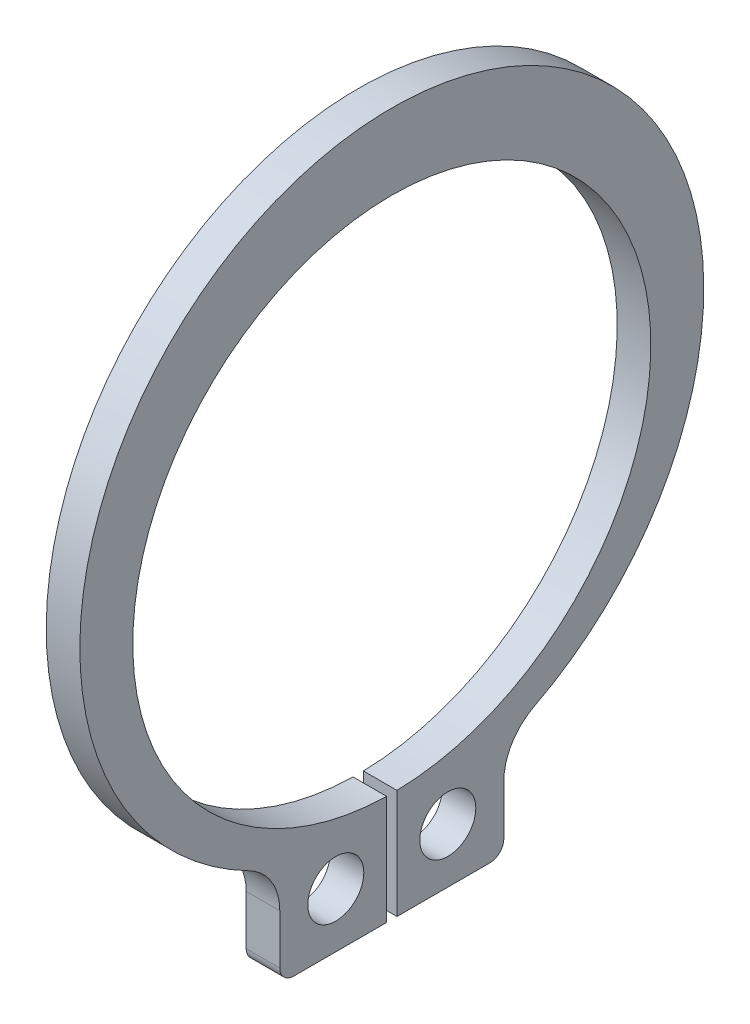
ISO-10303-21;
HEADER;
FILE_DESCRIPTION(('STEP AP214'),'2;1');
FILE_NAME('part.step','',(''),(''),'','','');
FILE_SCHEMA(('AUTOMOTIVE_DESIGN { 1 0 10303 214 1 1 1 1 }'));
ENDSEC;
DATA;
#1=APPLICATION_CONTEXT('core data for automotive mechanical design processes');
#2=APPLICATION_PROTOCOL_DEFINITION('international standard','automotive_design',2000,#1);
#3=PRODUCT_CONTEXT('',#1,'mechanical');
#4=PRODUCT('Part','Part','',(#3));
#5=PRODUCT_RELATED_PRODUCT_CATEGORY('part','',(#4));
#6=PRODUCT_DEFINITION_FORMATION('','',#4);
#7=PRODUCT_DEFINITION_CONTEXT('part definition',#1,'design');
#8=PRODUCT_DEFINITION('design','',#6,#7);
#9=PRODUCT_DEFINITION_SHAPE('','',#8);
#10=(LENGTH_UNIT() NAMED_UNIT(*) SI_UNIT(.MILLI.,.METRE.));
#11=(NAMED_UNIT(*) PLANE_ANGLE_UNIT() SI_UNIT($,.RADIAN.));
#12=(NAMED_UNIT(*) SI_UNIT($,.STERADIAN.) SOLID_ANGLE_UNIT());
#13=UNCERTAINTY_MEASURE_WITH_UNIT(LENGTH_MEASURE(1.E-05),#10,'distance_accuracy_value','');
#14=(GEOMETRIC_REPRESENTATION_CONTEXT(3) GLOBAL_UNCERTAINTY_ASSIGNED_CONTEXT((#13)) GLOBAL_UNIT_ASSIGNED_CONTEXT((#10,
#11,#12)) REPRESENTATION_CONTEXT('',''));
#15=CARTESIAN_POINT('',(0.,0.,0.));
#16=DIRECTION('',(0.,0.,1.));
#17=DIRECTION('',(1.,0.,0.));
#18=AXIS2_PLACEMENT_3D('',#15,#16,#17);
#19=CARTESIAN_POINT('',(0.6,-10.8801496996403,-6.));
#20=DIRECTION('',(-1.,0.,0.));
#21=DIRECTION('',(0.,0.,1.));
#22=AXIS2_PLACEMENT_3D('',#19,#20,#21);
#23=PLANE('',#22);
#24=CARTESIAN_POINT('',(0.6,-11.2,-2.));
#25=DIRECTION('',(1.,0.,0.));
#26=DIRECTION('',(0.,0.,-1.));
#27=AXIS2_PLACEMENT_3D('',#24,#25,#26);
#28=CIRCLE('',#27,1.);
#29=CARTESIAN_POINT('',(0.6,-11.2,-3.));
#30=VERTEX_POINT('',#29);
#31=EDGE_CURVE('E181',#30,#30,#28,.T.);
#32=ORIENTED_EDGE('',*,*,#31,.F.);
#33=EDGE_LOOP('',(#32));
#34=FACE_BOUND('',#33,.T.);
#35=CARTESIAN_POINT('',(0.6,-10.8801496996403,-6.));
#36=DIRECTION('',(-1.,0.,0.));
#37=DIRECTION('',(0.,0.,1.));
#38=AXIS2_PLACEMENT_3D('',#35,#36,#37);
#39=CIRCLE('',#38,2.);
#40=CARTESIAN_POINT('',(0.6,-10.8801496996403,-4.));
#41=VERTEX_POINT('',#40);
#42=CARTESIAN_POINT('',(0.6,-9.10082702568882,-5.08675807040949));
#43=VERTEX_POINT('',#42);
#44=EDGE_CURVE('E184',#41,#43,#39,.T.);
#45=ORIENTED_EDGE('',*,*,#44,.T.);
#46=CARTESIAN_POINT('',(0.6,0.809999999999997,0.));
#47=DIRECTION('',(1.,0.,0.));
#48=DIRECTION('',(0.,0.,-1.));
#49=AXIS2_PLACEMENT_3D('',#46,#47,#48);
#50=CIRCLE('',#49,11.14);
#51=CARTESIAN_POINT('',(0.6,-9.10082697223238,5.08675817456179));
#52=VERTEX_POINT('',#51);
#53=EDGE_CURVE('E128',#43,#52,#50,.T.);
#54=ORIENTED_EDGE('',*,*,#53,.T.);
#55=CARTESIAN_POINT('',(0.6,-10.8801496996403,6.00000000000004));
#56=DIRECTION('',(-1.,0.,0.));
#57=DIRECTION('',(0.,0.,1.));
#58=AXIS2_PLACEMENT_3D('',#55,#56,#57);
#59=CIRCLE('',#58,2.00000000000004);
#60=CARTESIAN_POINT('',(0.6,-10.8801496996403,4.));
#61=VERTEX_POINT('',#60);
#62=EDGE_CURVE('E187',#52,#61,#59,.T.);
#63=ORIENTED_EDGE('',*,*,#62,.T.);
#64=DIRECTION('',(0.,-1.,0.));
#65=VECTOR('',#64,1.);
#66=CARTESIAN_POINT('',(0.6,-10.8801496996403,4.));
#67=LINE('',#66,#65);
#68=CARTESIAN_POINT('',(0.6,-12.65,4.));
#69=VERTEX_POINT('',#68);
#70=EDGE_CURVE('E189',#61,#69,#67,.T.);
#71=ORIENTED_EDGE('',*,*,#70,.T.);
#72=CARTESIAN_POINT('',(0.6,-12.65,3.5));
#73=DIRECTION('',(1.,0.,0.));
#74=DIRECTION('',(0.,0.,-1.));
#75=AXIS2_PLACEMENT_3D('',#72,#73,#74);
#76=CIRCLE('',#75,0.499999999999999);
#77=CARTESIAN_POINT('',(0.6,-13.15,3.5));
#78=VERTEX_POINT('',#77);
#79=EDGE_CURVE('E191',#69,#78,#76,.T.);
#80=ORIENTED_EDGE('',*,*,#79,.T.);
#81=DIRECTION('',(0.,0.,-1.));
#82=VECTOR('',#81,1.);
#83=CARTESIAN_POINT('',(0.6,-13.15,3.5));
#84=LINE('',#83,#82);
#85=CARTESIAN_POINT('',(0.6,-13.15,0.185));
#86=VERTEX_POINT('',#85);
#87=EDGE_CURVE('E193',#78,#86,#84,.T.);
#88=ORIENTED_EDGE('',*,*,#87,.T.);
#89=DIRECTION('',(0.,1.,0.));
#90=VECTOR('',#89,1.);
#91=CARTESIAN_POINT('',(0.6,-13.15,0.185));
#92=LINE('',#91,#90);
#93=CARTESIAN_POINT('',(0.6,-9.24814981496299,0.185));
#94=VERTEX_POINT('',#93);
#95=EDGE_CURVE('E195',#86,#94,#92,.T.);
#96=ORIENTED_EDGE('',*,*,#95,.T.);
#97=CARTESIAN_POINT('',(0.6,0.,0.));
#98=DIRECTION('',(-1.,0.,0.));
#99=DIRECTION('',(0.,0.,1.));
#100=AXIS2_PLACEMENT_3D('',#97,#98,#99);
#101=CIRCLE('',#100,9.25);
#102=CARTESIAN_POINT('',(0.6,-9.24814981496299,-0.184999999999998));
#103=VERTEX_POINT('',#102);
#104=EDGE_CURVE('E197',#94,#103,#101,.T.);
#105=ORIENTED_EDGE('',*,*,#104,.T.);
#106=DIRECTION('',(0.,-1.,0.));
#107=VECTOR('',#106,1.);
#108=CARTESIAN_POINT('',(0.6,-9.24814981496299,-0.185));
#109=LINE('',#108,#107);
#110=CARTESIAN_POINT('',(0.6,-13.15,-0.185));
#111=VERTEX_POINT('',#110);
#112=EDGE_CURVE('E199',#103,#111,#109,.T.);
#113=ORIENTED_EDGE('',*,*,#112,.T.);
#114=DIRECTION('',(0.,0.,-1.));
#115=VECTOR('',#114,1.);
#116=CARTESIAN_POINT('',(0.6,-13.15,-0.185));
#117=LINE('',#116,#115);
#118=CARTESIAN_POINT('',(0.6,-13.15,-3.5));
#119=VERTEX_POINT('',#118);
#120=EDGE_CURVE('E201',#111,#119,#117,.T.);
#121=ORIENTED_EDGE('',*,*,#120,.T.);
#122=CARTESIAN_POINT('',(0.6,-12.65,-3.5));
#123=DIRECTION('',(1.,0.,0.));
#124=DIRECTION('',(0.,0.,-1.));
#125=AXIS2_PLACEMENT_3D('',#122,#123,#124);
#126=CIRCLE('',#125,0.500000000000002);
#127=CARTESIAN_POINT('',(0.6,-12.65,-4.));
#128=VERTEX_POINT('',#127);
#129=EDGE_CURVE('E56',#119,#128,#126,.T.);
#130=ORIENTED_EDGE('',*,*,#129,.T.);
#131=DIRECTION('',(0.,1.,0.));
#132=VECTOR('',#131,1.);
#133=CARTESIAN_POINT('',(0.6,-12.65,-4.));
#134=LINE('',#133,#132);
#135=EDGE_CURVE('E51',#128,#41,#134,.T.);
#136=ORIENTED_EDGE('',*,*,#135,.T.);
#137=EDGE_LOOP('',(#45,#54,#63,#71,#80,#88,#96,#105,#113,#121,#130,#136));
#138=FACE_BOUND('',#137,.T.);
#139=CARTESIAN_POINT('',(0.6,-11.2,2.));
#140=DIRECTION('',(1.,0.,0.));
#141=DIRECTION('',(0.,0.,-1.));
#142=AXIS2_PLACEMENT_3D('',#139,#140,#141);
#143=CIRCLE('',#142,1.);
#144=CARTESIAN_POINT('',(0.6,-11.2,1.));
#145=VERTEX_POINT('',#144);
#146=EDGE_CURVE('E178',#145,#145,#143,.T.);
#147=ORIENTED_EDGE('',*,*,#146,.F.);
#148=EDGE_LOOP('',(#147));
#149=FACE_BOUND('',#148,.T.);
#150=ADVANCED_FACE('F36',(#34,#138,#149),#23,.F.);
#151=CARTESIAN_POINT('',(0.6,-10.8801496996403,-6.));
#152=DIRECTION('',(-1.,0.,0.));
#153=DIRECTION('',(0.,0.,1.));
#154=AXIS2_PLACEMENT_3D('',#151,#152,#153);
#155=CYLINDRICAL_SURFACE('',#154,2.);
#156=DIRECTION('',(-1.,0.,0.));
#157=VECTOR('',#156,1.);
#158=CARTESIAN_POINT('',(0.6,-10.8801496996403,-4.));
#159=LINE('',#158,#157);
#160=CARTESIAN_POINT('',(-0.6,-10.8801496996403,-4.));
#161=VERTEX_POINT('',#160);
#162=EDGE_CURVE('E143',#41,#161,#159,.T.);
#163=ORIENTED_EDGE('',*,*,#162,.T.);
#164=CARTESIAN_POINT('',(-0.6,-10.8801496996403,-6.));
#165=DIRECTION('',(-1.,0.,0.));
#166=DIRECTION('',(0.,0.,1.));
#167=AXIS2_PLACEMENT_3D('',#164,#165,#166);
#168=CIRCLE('',#167,2.);
#169=CARTESIAN_POINT('',(-0.6,-9.10082702568882,-5.08675807040949));
#170=VERTEX_POINT('',#169);
#171=EDGE_CURVE('E137',#161,#170,#168,.T.);
#172=ORIENTED_EDGE('',*,*,#171,.T.);
#173=DIRECTION('',(-1.,0.,0.));
#174=VECTOR('',#173,1.);
#175=CARTESIAN_POINT('',(0.6,-9.10082702568882,-5.08675807040949));
#176=LINE('',#175,#174);
#177=EDGE_CURVE('E11',#43,#170,#176,.T.);
#178=ORIENTED_EDGE('',*,*,#177,.F.);
#179=ORIENTED_EDGE('',*,*,#44,.F.);
#180=EDGE_LOOP('',(#163,#172,#178,#179));
#181=FACE_BOUND('',#180,.T.);
#182=ADVANCED_FACE('F38',(#181),#155,.F.);
#183=CARTESIAN_POINT('',(0.6,0.809999999999997,0.));
#184=DIRECTION('',(-1.,0.,0.));
#185=DIRECTION('',(0.,0.,1.));
#186=AXIS2_PLACEMENT_3D('',#183,#184,#185);
#187=CYLINDRICAL_SURFACE('',#186,11.14);
#188=ORIENTED_EDGE('',*,*,#177,.T.);
#189=CARTESIAN_POINT('',(-0.6,0.809999999999997,0.));
#190=DIRECTION('',(1.,0.,0.));
#191=DIRECTION('',(0.,0.,-1.));
#192=AXIS2_PLACEMENT_3D('',#189,#190,#191);
#193=CIRCLE('',#192,11.14);
#194=CARTESIAN_POINT('',(-0.6,-9.10082697223238,5.08675817456179));
#195=VERTEX_POINT('',#194);
#196=EDGE_CURVE('E127',#170,#195,#193,.T.);
#197=ORIENTED_EDGE('',*,*,#196,.T.);
#198=DIRECTION('',(-1.,0.,0.));
#199=VECTOR('',#198,1.);
#200=CARTESIAN_POINT('',(0.6,-9.10082697223238,5.08675817456179));
#201=LINE('',#200,#199);
#202=EDGE_CURVE('E44',#52,#195,#201,.T.);
#203=ORIENTED_EDGE('',*,*,#202,.F.);
#204=ORIENTED_EDGE('',*,*,#53,.F.);
#205=EDGE_LOOP('',(#188,#197,#203,#204));
#206=FACE_BOUND('',#205,.T.);
#207=ADVANCED_FACE('F125',(#206),#187,.T.);
#208=CARTESIAN_POINT('',(0.6,-10.8801496996403,6.00000000000004));
#209=DIRECTION('',(-1.,0.,0.));
#210=DIRECTION('',(0.,0.,1.));
#211=AXIS2_PLACEMENT_3D('',#208,#209,#210);
#212=CYLINDRICAL_SURFACE('',#211,2.00000000000004);
#213=ORIENTED_EDGE('',*,*,#202,.T.);
#214=CARTESIAN_POINT('',(-0.6,-10.8801496996403,6.00000000000004));
#215=DIRECTION('',(-1.,0.,0.));
#216=DIRECTION('',(0.,0.,1.));
#217=AXIS2_PLACEMENT_3D('',#214,#215,#216);
#218=CIRCLE('',#217,2.00000000000004);
#219=CARTESIAN_POINT('',(-0.6,-10.8801496996403,4.));
#220=VERTEX_POINT('',#219);
#221=EDGE_CURVE('E141',#195,#220,#218,.T.);
#222=ORIENTED_EDGE('',*,*,#221,.T.);
#223=DIRECTION('',(-1.,0.,0.));
#224=VECTOR('',#223,1.);
#225=CARTESIAN_POINT('',(0.6,-10.8801496996403,4.));
#226=LINE('',#225,#224);
#227=EDGE_CURVE('E222',#61,#220,#226,.T.);
#228=ORIENTED_EDGE('',*,*,#227,.F.);
#229=ORIENTED_EDGE('',*,*,#62,.F.);
#230=EDGE_LOOP('',(#213,#222,#228,#229));
#231=FACE_BOUND('',#230,.T.);
#232=ADVANCED_FACE('F225',(#231),#212,.F.);
#233=CARTESIAN_POINT('',(0.6,-10.8801496996403,4.));
#234=DIRECTION('',(0.,0.,-1.));
#235=DIRECTION('',(-1.,0.,0.));
#236=AXIS2_PLACEMENT_3D('',#233,#234,#235);
#237=PLANE('',#236);
#238=ORIENTED_EDGE('',*,*,#227,.T.);
#239=DIRECTION('',(0.,-1.,0.));
#240=VECTOR('',#239,1.);
#241=CARTESIAN_POINT('',(-0.6,-10.8801496996403,4.));
#242=LINE('',#241,#240);
#243=CARTESIAN_POINT('',(-0.6,-12.65,4.));
#244=VERTEX_POINT('',#243);
#245=EDGE_CURVE('E152',#220,#244,#242,.T.);
#246=ORIENTED_EDGE('',*,*,#245,.T.);
#247=DIRECTION('',(-1.,0.,0.));
#248=VECTOR('',#247,1.);
#249=CARTESIAN_POINT('',(0.6,-12.65,4.));
#250=LINE('',#249,#248);
#251=EDGE_CURVE('E220',#69,#244,#250,.T.);
#252=ORIENTED_EDGE('',*,*,#251,.F.);
#253=ORIENTED_EDGE('',*,*,#70,.F.);
#254=EDGE_LOOP('',(#238,#246,#252,#253));
#255=FACE_BOUND('',#254,.T.);
#256=ADVANCED_FACE('F233',(#255),#237,.F.);
#257=CARTESIAN_POINT('',(0.6,-12.65,3.5));
#258=DIRECTION('',(-1.,0.,0.));
#259=DIRECTION('',(0.,0.,1.));
#260=AXIS2_PLACEMENT_3D('',#257,#258,#259);
#261=CYLINDRICAL_SURFACE('',#260,0.499999999999999);
#262=ORIENTED_EDGE('',*,*,#251,.T.);
#263=CARTESIAN_POINT('',(-0.6,-12.65,3.5));
#264=DIRECTION('',(1.,0.,0.));
#265=DIRECTION('',(0.,0.,-1.));
#266=AXIS2_PLACEMENT_3D('',#263,#264,#265);
#267=CIRCLE('',#266,0.499999999999999);
#268=CARTESIAN_POINT('',(-0.6,-13.15,3.5));
#269=VERTEX_POINT('',#268);
#270=EDGE_CURVE('E155',#244,#269,#267,.T.);
#271=ORIENTED_EDGE('',*,*,#270,.T.);
#272=DIRECTION('',(-1.,0.,0.));
#273=VECTOR('',#272,1.);
#274=CARTESIAN_POINT('',(0.6,-13.15,3.5));
#275=LINE('',#274,#273);
#276=EDGE_CURVE('E218',#78,#269,#275,.T.);
#277=ORIENTED_EDGE('',*,*,#276,.F.);
#278=ORIENTED_EDGE('',*,*,#79,.F.);
#279=EDGE_LOOP('',(#262,#271,#277,#278));
#280=FACE_BOUND('',#279,.T.);
#281=ADVANCED_FACE('F236',(#280),#261,.T.);
#282=CARTESIAN_POINT('',(0.6,-13.15,3.5));
#283=DIRECTION('',(0.,1.,0.));
#284=DIRECTION('',(0.,0.,1.));
#285=AXIS2_PLACEMENT_3D('',#282,#283,#284);
#286=PLANE('',#285);
#287=ORIENTED_EDGE('',*,*,#276,.T.);
#288=DIRECTION('',(0.,0.,-1.));
#289=VECTOR('',#288,1.);
#290=CARTESIAN_POINT('',(-0.6,-13.15,3.5));
#291=LINE('',#290,#289);
#292=CARTESIAN_POINT('',(-0.6,-13.15,0.185));
#293=VERTEX_POINT('',#292);
#294=EDGE_CURVE('E158',#269,#293,#291,.T.);
#295=ORIENTED_EDGE('',*,*,#294,.T.);
#296=DIRECTION('',(-1.,0.,0.));
#297=VECTOR('',#296,1.);
#298=CARTESIAN_POINT('',(0.6,-13.15,0.185));
#299=LINE('',#298,#297);
#300=EDGE_CURVE('E216',#86,#293,#299,.T.);
#301=ORIENTED_EDGE('',*,*,#300,.F.);
#302=ORIENTED_EDGE('',*,*,#87,.F.);
#303=EDGE_LOOP('',(#287,#295,#301,#302));
#304=FACE_BOUND('',#303,.T.);
#305=ADVANCED_FACE('F241',(#304),#286,.F.);
#306=CARTESIAN_POINT('',(0.6,-13.15,0.185));
#307=DIRECTION('',(0.,0.,1.));
#308=DIRECTION('',(0.,-1.,0.));
#309=AXIS2_PLACEMENT_3D('',#306,#307,#308);
#310=PLANE('',#309);
#311=ORIENTED_EDGE('',*,*,#300,.T.);
#312=DIRECTION('',(0.,1.,0.));
#313=VECTOR('',#312,1.);
#314=CARTESIAN_POINT('',(-0.6,-13.15,0.185));
#315=LINE('',#314,#313);
#316=CARTESIAN_POINT('',(-0.6,-9.24814981496299,0.185));
#317=VERTEX_POINT('',#316);
#318=EDGE_CURVE('E161',#293,#317,#315,.T.);
#319=ORIENTED_EDGE('',*,*,#318,.T.);
#320=DIRECTION('',(-1.,0.,0.));
#321=VECTOR('',#320,1.);
#322=CARTESIAN_POINT('',(0.6,-9.24814981496299,0.185));
#323=LINE('',#322,#321);
#324=EDGE_CURVE('E214',#94,#317,#323,.T.);
#325=ORIENTED_EDGE('',*,*,#324,.F.);
#326=ORIENTED_EDGE('',*,*,#95,.F.);
#327=EDGE_LOOP('',(#311,#319,#325,#326));
#328=FACE_BOUND('',#327,.T.);
#329=ADVANCED_FACE('F247',(#328),#310,.F.);
#330=CARTESIAN_POINT('',(0.6,0.,0.));
#331=DIRECTION('',(-1.,0.,0.));
#332=DIRECTION('',(0.,0.,1.));
#333=AXIS2_PLACEMENT_3D('',#330,#331,#332);
#334=CYLINDRICAL_SURFACE('',#333,9.25);
#335=ORIENTED_EDGE('',*,*,#324,.T.);
#336=CARTESIAN_POINT('',(-0.6,0.,0.));
#337=DIRECTION('',(-1.,0.,0.));
#338=DIRECTION('',(0.,0.,1.));
#339=AXIS2_PLACEMENT_3D('',#336,#337,#338);
#340=CIRCLE('',#339,9.25);
#341=CARTESIAN_POINT('',(-0.6,-9.24814981496299,-0.184999999999998));
#342=VERTEX_POINT('',#341);
#343=EDGE_CURVE('E164',#317,#342,#340,.T.);
#344=ORIENTED_EDGE('',*,*,#343,.T.);
#345=DIRECTION('',(-1.,0.,0.));
#346=VECTOR('',#345,1.);
#347=CARTESIAN_POINT('',(0.6,-9.24814981496299,-0.184999999999998));
#348=LINE('',#347,#346);
#349=EDGE_CURVE('E212',#103,#342,#348,.T.);
#350=ORIENTED_EDGE('',*,*,#349,.F.);
#351=ORIENTED_EDGE('',*,*,#104,.F.);
#352=EDGE_LOOP('',(#335,#344,#350,#351));
#353=FACE_BOUND('',#352,.T.);
#354=ADVANCED_FACE('F251',(#353),#334,.F.);
#355=CARTESIAN_POINT('',(0.6,-9.24814981496299,-0.185));
#356=DIRECTION('',(0.,0.,-1.));
#357=DIRECTION('',(0.,1.,0.));
#358=AXIS2_PLACEMENT_3D('',#355,#356,#357);
#359=PLANE('',#358);
#360=ORIENTED_EDGE('',*,*,#349,.T.);
#361=DIRECTION('',(0.,-1.,0.));
#362=VECTOR('',#361,1.);
#363=CARTESIAN_POINT('',(-0.6,-9.24814981496299,-0.185));
#364=LINE('',#363,#362);
#365=CARTESIAN_POINT('',(-0.6,-13.15,-0.185));
#366=VERTEX_POINT('',#365);
#367=EDGE_CURVE('E167',#342,#366,#364,.T.);
#368=ORIENTED_EDGE('',*,*,#367,.T.);
#369=DIRECTION('',(-1.,0.,0.));
#370=VECTOR('',#369,1.);
#371=CARTESIAN_POINT('',(0.6,-13.15,-0.185));
#372=LINE('',#371,#370);
#373=EDGE_CURVE('E210',#111,#366,#372,.T.);
#374=ORIENTED_EDGE('',*,*,#373,.F.);
#375=ORIENTED_EDGE('',*,*,#112,.F.);
#376=EDGE_LOOP('',(#360,#368,#374,#375));
#377=FACE_BOUND('',#376,.T.);
#378=ADVANCED_FACE('F256',(#377),#359,.F.);
#379=CARTESIAN_POINT('',(0.6,-13.15,-0.185));
#380=DIRECTION('',(0.,1.,0.));
#381=DIRECTION('',(0.,0.,1.));
#382=AXIS2_PLACEMENT_3D('',#379,#380,#381);
#383=PLANE('',#382);
#384=ORIENTED_EDGE('',*,*,#373,.T.);
#385=DIRECTION('',(0.,0.,-1.));
#386=VECTOR('',#385,1.);
#387=CARTESIAN_POINT('',(-0.6,-13.15,-0.185));
#388=LINE('',#387,#386);
#389=CARTESIAN_POINT('',(-0.6,-13.15,-3.5));
#390=VERTEX_POINT('',#389);
#391=EDGE_CURVE('E170',#366,#390,#388,.T.);
#392=ORIENTED_EDGE('',*,*,#391,.T.);
#393=DIRECTION('',(-1.,0.,0.));
#394=VECTOR('',#393,1.);
#395=CARTESIAN_POINT('',(0.6,-13.15,-3.5));
#396=LINE('',#395,#394);
#397=EDGE_CURVE('E208',#119,#390,#396,.T.);
#398=ORIENTED_EDGE('',*,*,#397,.F.);
#399=ORIENTED_EDGE('',*,*,#120,.F.);
#400=EDGE_LOOP('',(#384,#392,#398,#399));
#401=FACE_BOUND('',#400,.T.);
#402=ADVANCED_FACE('F260',(#401),#383,.F.);
#403=CARTESIAN_POINT('',(0.6,-12.65,-3.5));
#404=DIRECTION('',(-1.,0.,0.));
#405=DIRECTION('',(0.,0.,1.));
#406=AXIS2_PLACEMENT_3D('',#403,#404,#405);
#407=CYLINDRICAL_SURFACE('',#406,0.500000000000002);
#408=ORIENTED_EDGE('',*,*,#397,.T.);
#409=CARTESIAN_POINT('',(-0.6,-12.65,-3.5));
#410=DIRECTION('',(1.,0.,0.));
#411=DIRECTION('',(0.,0.,-1.));
#412=AXIS2_PLACEMENT_3D('',#409,#410,#411);
#413=CIRCLE('',#412,0.500000000000002);
#414=CARTESIAN_POINT('',(-0.6,-12.65,-4.));
#415=VERTEX_POINT('',#414);
#416=EDGE_CURVE('E173',#390,#415,#413,.T.);
#417=ORIENTED_EDGE('',*,*,#416,.T.);
#418=DIRECTION('',(-1.,0.,0.));
#419=VECTOR('',#418,1.);
#420=CARTESIAN_POINT('',(0.6,-12.65,-4.));
#421=LINE('',#420,#419);
#422=EDGE_CURVE('E206',#128,#415,#421,.T.);
#423=ORIENTED_EDGE('',*,*,#422,.F.);
#424=ORIENTED_EDGE('',*,*,#129,.F.);
#425=EDGE_LOOP('',(#408,#417,#423,#424));
#426=FACE_BOUND('',#425,.T.);
#427=ADVANCED_FACE('F264',(#426),#407,.T.);
#428=CARTESIAN_POINT('',(0.6,-12.65,-4.));
#429=DIRECTION('',(0.,0.,1.));
#430=DIRECTION('',(1.,0.,0.));
#431=AXIS2_PLACEMENT_3D('',#428,#429,#430);
#432=PLANE('',#431);
#433=ORIENTED_EDGE('',*,*,#422,.T.);
#434=DIRECTION('',(0.,1.,0.));
#435=VECTOR('',#434,1.);
#436=CARTESIAN_POINT('',(-0.6,-12.65,-4.));
#437=LINE('',#436,#435);
#438=EDGE_CURVE('E176',#415,#161,#437,.T.);
#439=ORIENTED_EDGE('',*,*,#438,.T.);
#440=ORIENTED_EDGE('',*,*,#162,.F.);
#441=ORIENTED_EDGE('',*,*,#135,.F.);
#442=EDGE_LOOP('',(#433,#439,#440,#441));
#443=FACE_BOUND('',#442,.T.);
#444=ADVANCED_FACE('F266',(#443),#432,.F.);
#445=CARTESIAN_POINT('',(0.6,-11.2,-2.));
#446=DIRECTION('',(-1.,0.,0.));
#447=DIRECTION('',(0.,0.,1.));
#448=AXIS2_PLACEMENT_3D('',#445,#446,#447);
#449=CYLINDRICAL_SURFACE('',#448,1.);
#450=ORIENTED_EDGE('',*,*,#31,.T.);
#451=EDGE_LOOP('',(#450));
#452=FACE_BOUND('',#451,.T.);
#453=CARTESIAN_POINT('',(-0.6,-11.2,-2.));
#454=DIRECTION('',(1.,0.,0.));
#455=DIRECTION('',(0.,0.,-1.));
#456=AXIS2_PLACEMENT_3D('',#453,#454,#455);
#457=CIRCLE('',#456,1.);
#458=CARTESIAN_POINT('',(-0.6,-11.2,-3.));
#459=VERTEX_POINT('',#458);
#460=EDGE_CURVE('E144',#459,#459,#457,.T.);
#461=ORIENTED_EDGE('',*,*,#460,.F.);
#462=EDGE_LOOP('',(#461));
#463=FACE_BOUND('',#462,.T.);
#464=ADVANCED_FACE('F268',(#452,#463),#449,.F.);
#465=CARTESIAN_POINT('',(0.6,-11.2,2.));
#466=DIRECTION('',(-1.,0.,0.));
#467=DIRECTION('',(0.,0.,1.));
#468=AXIS2_PLACEMENT_3D('',#465,#466,#467);
#469=CYLINDRICAL_SURFACE('',#468,1.);
#470=ORIENTED_EDGE('',*,*,#146,.T.);
#471=EDGE_LOOP('',(#470));
#472=FACE_BOUND('',#471,.T.);
#473=CARTESIAN_POINT('',(-0.6,-11.2,2.));
#474=DIRECTION('',(1.,0.,0.));
#475=DIRECTION('',(0.,0.,-1.));
#476=AXIS2_PLACEMENT_3D('',#473,#474,#475);
#477=CIRCLE('',#476,1.);
#478=CARTESIAN_POINT('',(-0.6,-11.2,1.));
#479=VERTEX_POINT('',#478);
#480=EDGE_CURVE('E147',#479,#479,#477,.T.);
#481=ORIENTED_EDGE('',*,*,#480,.F.);
#482=EDGE_LOOP('',(#481));
#483=FACE_BOUND('',#482,.T.);
#484=ADVANCED_FACE('F274',(#472,#483),#469,.F.);
#485=CARTESIAN_POINT('',(-0.6,-10.8801496996403,-6.));
#486=DIRECTION('',(-1.,0.,0.));
#487=DIRECTION('',(0.,0.,1.));
#488=AXIS2_PLACEMENT_3D('',#485,#486,#487);
#489=PLANE('',#488);
#490=ORIENTED_EDGE('',*,*,#480,.T.);
#491=EDGE_LOOP('',(#490));
#492=FACE_BOUND('',#491,.T.);
#493=ORIENTED_EDGE('',*,*,#460,.T.);
#494=EDGE_LOOP('',(#493));
#495=FACE_BOUND('',#494,.T.);
#496=ORIENTED_EDGE('',*,*,#171,.F.);
#497=ORIENTED_EDGE('',*,*,#438,.F.);
#498=ORIENTED_EDGE('',*,*,#416,.F.);
#499=ORIENTED_EDGE('',*,*,#391,.F.);
#500=ORIENTED_EDGE('',*,*,#367,.F.);
#501=ORIENTED_EDGE('',*,*,#343,.F.);
#502=ORIENTED_EDGE('',*,*,#318,.F.);
#503=ORIENTED_EDGE('',*,*,#294,.F.);
#504=ORIENTED_EDGE('',*,*,#270,.F.);
#505=ORIENTED_EDGE('',*,*,#245,.F.);
#506=ORIENTED_EDGE('',*,*,#221,.F.);
#507=ORIENTED_EDGE('',*,*,#196,.F.);
#508=EDGE_LOOP('',(#496,#497,#498,#499,#500,#501,#502,#503,#504,#505,#506,#507));
#509=FACE_BOUND('',#508,.T.);
#510=ADVANCED_FACE('F135',(#492,#495,#509),#489,.T.);
#511=CLOSED_SHELL('',(#150,#182,#207,#232,#256,#281,#305,#329,#354,#378,#402,#427,#444,#464,
#484,#510));
#512=MANIFOLD_SOLID_BREP('B2',#511);
#513=ADVANCED_BREP_SHAPE_REPRESENTATION('',(#18,#512),#14);
#514=SHAPE_DEFINITION_REPRESENTATION(#9,#513);
ENDSEC;
END-ISO-10303-21;
